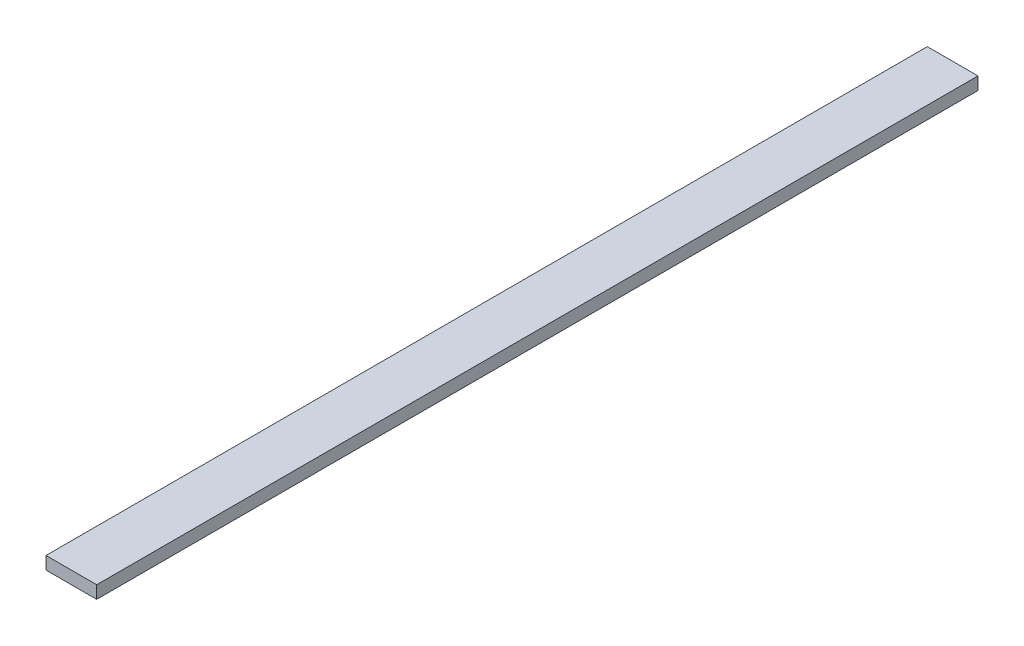
ISO-10303-21;
HEADER;
FILE_DESCRIPTION(('STEP AP214'),'2;1');
FILE_NAME('part.step','',(''),(''),'','','');
FILE_SCHEMA(('AUTOMOTIVE_DESIGN { 1 0 10303 214 1 1 1 1 }'));
ENDSEC;
DATA;
#1=APPLICATION_CONTEXT('core data for automotive mechanical design processes');
#2=APPLICATION_PROTOCOL_DEFINITION('international standard','automotive_design',2000,#1);
#3=PRODUCT_CONTEXT('',#1,'mechanical');
#4=PRODUCT('Part','Part','',(#3));
#5=PRODUCT_RELATED_PRODUCT_CATEGORY('part','',(#4));
#6=PRODUCT_DEFINITION_FORMATION('','',#4);
#7=PRODUCT_DEFINITION_CONTEXT('part definition',#1,'design');
#8=PRODUCT_DEFINITION('design','',#6,#7);
#9=PRODUCT_DEFINITION_SHAPE('','',#8);
#10=(LENGTH_UNIT() NAMED_UNIT(*) SI_UNIT(.MILLI.,.METRE.));
#11=(NAMED_UNIT(*) PLANE_ANGLE_UNIT() SI_UNIT($,.RADIAN.));
#12=(NAMED_UNIT(*) SI_UNIT($,.STERADIAN.) SOLID_ANGLE_UNIT());
#13=UNCERTAINTY_MEASURE_WITH_UNIT(LENGTH_MEASURE(1.E-05),#10,'distance_accuracy_value','');
#14=(GEOMETRIC_REPRESENTATION_CONTEXT(3) GLOBAL_UNCERTAINTY_ASSIGNED_CONTEXT((#13)) GLOBAL_UNIT_ASSIGNED_CONTEXT((#10,
#11,#12)) REPRESENTATION_CONTEXT('',''));
#15=CARTESIAN_POINT('',(0.,0.,0.));
#16=DIRECTION('',(0.,0.,1.));
#17=DIRECTION('',(1.,0.,0.));
#18=AXIS2_PLACEMENT_3D('',#15,#16,#17);
#19=CARTESIAN_POINT('',(0.,1.,0.));
#20=DIRECTION('',(1.,0.,0.));
#21=DIRECTION('',(0.,0.,-1.));
#22=AXIS2_PLACEMENT_3D('',#19,#20,#21);
#23=PLANE('',#22);
#24=DIRECTION('',(0.,0.,1.));
#25=VECTOR('',#24,1.);
#26=CARTESIAN_POINT('',(0.,0.,0.));
#27=LINE('',#26,#25);
#28=CARTESIAN_POINT('',(0.,0.,0.));
#29=VERTEX_POINT('',#28);
#30=CARTESIAN_POINT('',(0.,0.,69.55));
#31=VERTEX_POINT('',#30);
#32=EDGE_CURVE('E96',#29,#31,#27,.T.);
#33=ORIENTED_EDGE('',*,*,#32,.T.);
#34=DIRECTION('',(0.,-1.,0.));
#35=VECTOR('',#34,1.);
#36=CARTESIAN_POINT('',(0.,1.,69.55));
#37=LINE('',#36,#35);
#38=CARTESIAN_POINT('',(0.,1.,69.55));
#39=VERTEX_POINT('',#38);
#40=EDGE_CURVE('E11',#39,#31,#37,.T.);
#41=ORIENTED_EDGE('',*,*,#40,.F.);
#42=DIRECTION('',(0.,0.,1.));
#43=VECTOR('',#42,1.);
#44=CARTESIAN_POINT('',(0.,1.,0.));
#45=LINE('',#44,#43);
#46=CARTESIAN_POINT('',(0.,1.,0.));
#47=VERTEX_POINT('',#46);
#48=EDGE_CURVE('E84',#47,#39,#45,.T.);
#49=ORIENTED_EDGE('',*,*,#48,.F.);
#50=DIRECTION('',(0.,-1.,0.));
#51=VECTOR('',#50,1.);
#52=CARTESIAN_POINT('',(0.,1.,0.));
#53=LINE('',#52,#51);
#54=EDGE_CURVE('E92',#47,#29,#53,.T.);
#55=ORIENTED_EDGE('',*,*,#54,.T.);
#56=EDGE_LOOP('',(#33,#41,#49,#55));
#57=FACE_BOUND('',#56,.T.);
#58=ADVANCED_FACE('F33',(#57),#23,.F.);
#59=CARTESIAN_POINT('',(0.,1.,69.55));
#60=DIRECTION('',(0.,0.,-1.));
#61=DIRECTION('',(-1.,0.,0.));
#62=AXIS2_PLACEMENT_3D('',#59,#60,#61);
#63=PLANE('',#62);
#64=DIRECTION('',(1.,0.,0.));
#65=VECTOR('',#64,1.);
#66=CARTESIAN_POINT('',(0.,0.,69.55));
#67=LINE('',#66,#65);
#68=CARTESIAN_POINT('',(4.00000000000001,0.,69.55));
#69=VERTEX_POINT('',#68);
#70=EDGE_CURVE('E88',#31,#69,#67,.T.);
#71=ORIENTED_EDGE('',*,*,#70,.T.);
#72=DIRECTION('',(0.,-1.,0.));
#73=VECTOR('',#72,1.);
#74=CARTESIAN_POINT('',(4.00000000000001,1.,69.55));
#75=LINE('',#74,#73);
#76=CARTESIAN_POINT('',(4.00000000000001,1.,69.55));
#77=VERTEX_POINT('',#76);
#78=EDGE_CURVE('E41',#77,#69,#75,.T.);
#79=ORIENTED_EDGE('',*,*,#78,.F.);
#80=DIRECTION('',(1.,0.,0.));
#81=VECTOR('',#80,1.);
#82=CARTESIAN_POINT('',(0.,1.,69.55));
#83=LINE('',#82,#81);
#84=EDGE_CURVE('E79',#39,#77,#83,.T.);
#85=ORIENTED_EDGE('',*,*,#84,.F.);
#86=ORIENTED_EDGE('',*,*,#40,.T.);
#87=EDGE_LOOP('',(#71,#79,#85,#86));
#88=FACE_BOUND('',#87,.T.);
#89=ADVANCED_FACE('F87',(#88),#63,.F.);
#90=CARTESIAN_POINT('',(4.,1.,0.));
#91=DIRECTION('',(-1.,0.,0.));
#92=DIRECTION('',(0.,0.,1.));
#93=AXIS2_PLACEMENT_3D('',#90,#91,#92);
#94=PLANE('',#93);
#95=DIRECTION('',(0.,0.,-1.));
#96=VECTOR('',#95,1.);
#97=CARTESIAN_POINT('',(4.,0.,0.));
#98=LINE('',#97,#96);
#99=CARTESIAN_POINT('',(4.,0.,0.));
#100=VERTEX_POINT('',#99);
#101=EDGE_CURVE('E66',#69,#100,#98,.T.);
#102=ORIENTED_EDGE('',*,*,#101,.T.);
#103=DIRECTION('',(0.,-1.,0.));
#104=VECTOR('',#103,1.);
#105=CARTESIAN_POINT('',(4.,1.,0.));
#106=LINE('',#105,#104);
#107=CARTESIAN_POINT('',(4.,1.,0.));
#108=VERTEX_POINT('',#107);
#109=EDGE_CURVE('E89',#108,#100,#106,.T.);
#110=ORIENTED_EDGE('',*,*,#109,.F.);
#111=DIRECTION('',(0.,0.,-1.));
#112=VECTOR('',#111,1.);
#113=CARTESIAN_POINT('',(4.,1.,0.));
#114=LINE('',#113,#112);
#115=EDGE_CURVE('E82',#77,#108,#114,.T.);
#116=ORIENTED_EDGE('',*,*,#115,.F.);
#117=ORIENTED_EDGE('',*,*,#78,.T.);
#118=EDGE_LOOP('',(#102,#110,#116,#117));
#119=FACE_BOUND('',#118,.T.);
#120=ADVANCED_FACE('F90',(#119),#94,.F.);
#121=CARTESIAN_POINT('',(0.,1.,0.));
#122=DIRECTION('',(0.,0.,1.));
#123=DIRECTION('',(1.,0.,0.));
#124=AXIS2_PLACEMENT_3D('',#121,#122,#123);
#125=PLANE('',#124);
#126=DIRECTION('',(-1.,0.,0.));
#127=VECTOR('',#126,1.);
#128=CARTESIAN_POINT('',(0.,0.,0.));
#129=LINE('',#128,#127);
#130=EDGE_CURVE('E72',#100,#29,#129,.T.);
#131=ORIENTED_EDGE('',*,*,#130,.T.);
#132=ORIENTED_EDGE('',*,*,#54,.F.);
#133=DIRECTION('',(-1.,0.,0.));
#134=VECTOR('',#133,1.);
#135=CARTESIAN_POINT('',(0.,1.,0.));
#136=LINE('',#135,#134);
#137=EDGE_CURVE('E49',#108,#47,#136,.T.);
#138=ORIENTED_EDGE('',*,*,#137,.F.);
#139=ORIENTED_EDGE('',*,*,#109,.T.);
#140=EDGE_LOOP('',(#131,#132,#138,#139));
#141=FACE_BOUND('',#140,.T.);
#142=ADVANCED_FACE('F103',(#141),#125,.F.);
#143=CARTESIAN_POINT('',(0.,1.,0.));
#144=DIRECTION('',(0.,1.,0.));
#145=DIRECTION('',(0.,0.,1.));
#146=AXIS2_PLACEMENT_3D('',#143,#144,#145);
#147=PLANE('',#146);
#148=ORIENTED_EDGE('',*,*,#48,.T.);
#149=ORIENTED_EDGE('',*,*,#84,.T.);
#150=ORIENTED_EDGE('',*,*,#115,.T.);
#151=ORIENTED_EDGE('',*,*,#137,.T.);
#152=EDGE_LOOP('',(#148,#149,#150,#151));
#153=FACE_BOUND('',#152,.T.);
#154=ADVANCED_FACE('F80',(#153),#147,.T.);
#155=CARTESIAN_POINT('',(0.,0.,0.));
#156=DIRECTION('',(0.,1.,0.));
#157=DIRECTION('',(0.,0.,1.));
#158=AXIS2_PLACEMENT_3D('',#155,#156,#157);
#159=PLANE('',#158);
#160=ORIENTED_EDGE('',*,*,#32,.F.);
#161=ORIENTED_EDGE('',*,*,#130,.F.);
#162=ORIENTED_EDGE('',*,*,#101,.F.);
#163=ORIENTED_EDGE('',*,*,#70,.F.);
#164=EDGE_LOOP('',(#160,#161,#162,#163));
#165=FACE_BOUND('',#164,.T.);
#166=ADVANCED_FACE('F106',(#165),#159,.F.);
#167=CLOSED_SHELL('',(#58,#89,#120,#142,#154,#166));
#168=MANIFOLD_SOLID_BREP('B2',#167);
#169=ADVANCED_BREP_SHAPE_REPRESENTATION('',(#18,#168),#14);
#170=SHAPE_DEFINITION_REPRESENTATION(#9,#169);
ENDSEC;
END-ISO-10303-21;
